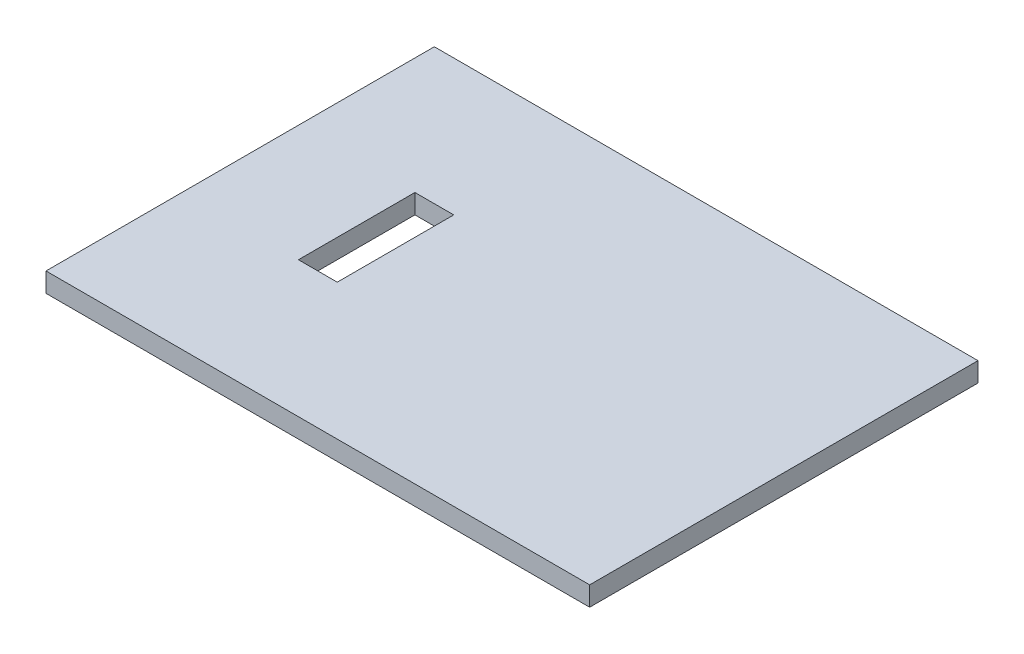
ISO-10303-21;
HEADER;
FILE_DESCRIPTION(('STEP AP214'),'2;1');
FILE_NAME('part.step','',(''),(''),'','','');
FILE_SCHEMA(('AUTOMOTIVE_DESIGN { 1 0 10303 214 1 1 1 1 }'));
ENDSEC;
DATA;
#1=APPLICATION_CONTEXT('core data for automotive mechanical design processes');
#2=APPLICATION_PROTOCOL_DEFINITION('international standard','automotive_design',2000,#1);
#3=PRODUCT_CONTEXT('',#1,'mechanical');
#4=PRODUCT('Part','Part','',(#3));
#5=PRODUCT_RELATED_PRODUCT_CATEGORY('part','',(#4));
#6=PRODUCT_DEFINITION_FORMATION('','',#4);
#7=PRODUCT_DEFINITION_CONTEXT('part definition',#1,'design');
#8=PRODUCT_DEFINITION('design','',#6,#7);
#9=PRODUCT_DEFINITION_SHAPE('','',#8);
#10=(LENGTH_UNIT() NAMED_UNIT(*) SI_UNIT(.MILLI.,.METRE.));
#11=(NAMED_UNIT(*) PLANE_ANGLE_UNIT() SI_UNIT($,.RADIAN.));
#12=(NAMED_UNIT(*) SI_UNIT($,.STERADIAN.) SOLID_ANGLE_UNIT());
#13=UNCERTAINTY_MEASURE_WITH_UNIT(LENGTH_MEASURE(1.E-05),#10,'distance_accuracy_value','');
#14=(GEOMETRIC_REPRESENTATION_CONTEXT(3) GLOBAL_UNCERTAINTY_ASSIGNED_CONTEXT((#13)) GLOBAL_UNIT_ASSIGNED_CONTEXT((#10,
#11,#12)) REPRESENTATION_CONTEXT('',''));
#15=CARTESIAN_POINT('',(0.,0.,0.));
#16=DIRECTION('',(0.,0.,1.));
#17=DIRECTION('',(1.,0.,0.));
#18=AXIS2_PLACEMENT_3D('',#15,#16,#17);
#19=CARTESIAN_POINT('',(-35.,2.5,25.));
#20=DIRECTION('',(1.,0.,0.));
#21=DIRECTION('',(0.,0.,-1.));
#22=AXIS2_PLACEMENT_3D('',#19,#20,#21);
#23=PLANE('',#22);
#24=DIRECTION('',(0.,0.,1.));
#25=VECTOR('',#24,1.);
#26=CARTESIAN_POINT('',(-35.,0.,25.));
#27=LINE('',#26,#25);
#28=CARTESIAN_POINT('',(-35.,0.,-25.));
#29=VERTEX_POINT('',#28);
#30=CARTESIAN_POINT('',(-35.,0.,25.));
#31=VERTEX_POINT('',#30);
#32=EDGE_CURVE('E130',#29,#31,#27,.T.);
#33=ORIENTED_EDGE('',*,*,#32,.T.);
#34=DIRECTION('',(0.,-1.,0.));
#35=VECTOR('',#34,1.);
#36=CARTESIAN_POINT('',(-35.,2.5,25.));
#37=LINE('',#36,#35);
#38=CARTESIAN_POINT('',(-35.,2.5,25.));
#39=VERTEX_POINT('',#38);
#40=EDGE_CURVE('E11',#39,#31,#37,.T.);
#41=ORIENTED_EDGE('',*,*,#40,.F.);
#42=DIRECTION('',(0.,0.,1.));
#43=VECTOR('',#42,1.);
#44=CARTESIAN_POINT('',(-35.,2.5,25.));
#45=LINE('',#44,#43);
#46=CARTESIAN_POINT('',(-35.,2.5,-25.));
#47=VERTEX_POINT('',#46);
#48=EDGE_CURVE('E134',#47,#39,#45,.T.);
#49=ORIENTED_EDGE('',*,*,#48,.F.);
#50=DIRECTION('',(0.,-1.,0.));
#51=VECTOR('',#50,1.);
#52=CARTESIAN_POINT('',(-35.,2.5,-25.));
#53=LINE('',#52,#51);
#54=EDGE_CURVE('E144',#47,#29,#53,.T.);
#55=ORIENTED_EDGE('',*,*,#54,.T.);
#56=EDGE_LOOP('',(#33,#41,#49,#55));
#57=FACE_BOUND('',#56,.T.);
#58=ADVANCED_FACE('F33',(#57),#23,.F.);
#59=CARTESIAN_POINT('',(35.,2.5,25.));
#60=DIRECTION('',(0.,0.,-1.));
#61=DIRECTION('',(-1.,0.,0.));
#62=AXIS2_PLACEMENT_3D('',#59,#60,#61);
#63=PLANE('',#62);
#64=DIRECTION('',(1.,0.,0.));
#65=VECTOR('',#64,1.);
#66=CARTESIAN_POINT('',(35.,0.,25.));
#67=LINE('',#66,#65);
#68=CARTESIAN_POINT('',(35.,0.,25.));
#69=VERTEX_POINT('',#68);
#70=EDGE_CURVE('E147',#31,#69,#67,.T.);
#71=ORIENTED_EDGE('',*,*,#70,.T.);
#72=DIRECTION('',(0.,-1.,0.));
#73=VECTOR('',#72,1.);
#74=CARTESIAN_POINT('',(35.,2.5,25.));
#75=LINE('',#74,#73);
#76=CARTESIAN_POINT('',(35.,2.5,25.));
#77=VERTEX_POINT('',#76);
#78=EDGE_CURVE('E40',#77,#69,#75,.T.);
#79=ORIENTED_EDGE('',*,*,#78,.F.);
#80=DIRECTION('',(1.,0.,0.));
#81=VECTOR('',#80,1.);
#82=CARTESIAN_POINT('',(35.,2.5,25.));
#83=LINE('',#82,#81);
#84=EDGE_CURVE('E137',#39,#77,#83,.T.);
#85=ORIENTED_EDGE('',*,*,#84,.F.);
#86=ORIENTED_EDGE('',*,*,#40,.T.);
#87=EDGE_LOOP('',(#71,#79,#85,#86));
#88=FACE_BOUND('',#87,.T.);
#89=ADVANCED_FACE('F175',(#88),#63,.F.);
#90=CARTESIAN_POINT('',(35.,2.5,25.));
#91=DIRECTION('',(-1.,0.,0.));
#92=DIRECTION('',(0.,0.,1.));
#93=AXIS2_PLACEMENT_3D('',#90,#91,#92);
#94=PLANE('',#93);
#95=DIRECTION('',(0.,0.,-1.));
#96=VECTOR('',#95,1.);
#97=CARTESIAN_POINT('',(35.,0.,25.));
#98=LINE('',#97,#96);
#99=CARTESIAN_POINT('',(35.,0.,-25.));
#100=VERTEX_POINT('',#99);
#101=EDGE_CURVE('E149',#69,#100,#98,.T.);
#102=ORIENTED_EDGE('',*,*,#101,.T.);
#103=DIRECTION('',(0.,-1.,0.));
#104=VECTOR('',#103,1.);
#105=CARTESIAN_POINT('',(35.,2.5,-25.));
#106=LINE('',#105,#104);
#107=CARTESIAN_POINT('',(35.,2.5,-25.));
#108=VERTEX_POINT('',#107);
#109=EDGE_CURVE('E154',#108,#100,#106,.T.);
#110=ORIENTED_EDGE('',*,*,#109,.F.);
#111=DIRECTION('',(0.,0.,-1.));
#112=VECTOR('',#111,1.);
#113=CARTESIAN_POINT('',(35.,2.5,25.));
#114=LINE('',#113,#112);
#115=EDGE_CURVE('E140',#77,#108,#114,.T.);
#116=ORIENTED_EDGE('',*,*,#115,.F.);
#117=ORIENTED_EDGE('',*,*,#78,.T.);
#118=EDGE_LOOP('',(#102,#110,#116,#117));
#119=FACE_BOUND('',#118,.T.);
#120=ADVANCED_FACE('F161',(#119),#94,.F.);
#121=CARTESIAN_POINT('',(35.,2.5,-25.));
#122=DIRECTION('',(0.,0.,1.));
#123=DIRECTION('',(1.,0.,0.));
#124=AXIS2_PLACEMENT_3D('',#121,#122,#123);
#125=PLANE('',#124);
#126=DIRECTION('',(-1.,0.,0.));
#127=VECTOR('',#126,1.);
#128=CARTESIAN_POINT('',(35.,0.,-25.));
#129=LINE('',#128,#127);
#130=EDGE_CURVE('E138',#100,#29,#129,.T.);
#131=ORIENTED_EDGE('',*,*,#130,.T.);
#132=ORIENTED_EDGE('',*,*,#54,.F.);
#133=DIRECTION('',(-1.,0.,0.));
#134=VECTOR('',#133,1.);
#135=CARTESIAN_POINT('',(35.,2.5,-25.));
#136=LINE('',#135,#134);
#137=EDGE_CURVE('E142',#108,#47,#136,.T.);
#138=ORIENTED_EDGE('',*,*,#137,.F.);
#139=ORIENTED_EDGE('',*,*,#109,.T.);
#140=EDGE_LOOP('',(#131,#132,#138,#139));
#141=FACE_BOUND('',#140,.T.);
#142=ADVANCED_FACE('F168',(#141),#125,.F.);
#143=CARTESIAN_POINT('',(0.,2.5,0.));
#144=DIRECTION('',(0.,1.,0.));
#145=DIRECTION('',(0.,0.,1.));
#146=AXIS2_PLACEMENT_3D('',#143,#144,#145);
#147=PLANE('',#146);
#148=DIRECTION('',(0.,0.,1.));
#149=VECTOR('',#148,1.);
#150=CARTESIAN_POINT('',(-20.,2.5,7.5));
#151=LINE('',#150,#149);
#152=CARTESIAN_POINT('',(-20.,2.5,-7.5));
#153=VERTEX_POINT('',#152);
#154=CARTESIAN_POINT('',(-20.,2.5,7.5));
#155=VERTEX_POINT('',#154);
#156=EDGE_CURVE('E47',#153,#155,#151,.T.);
#157=ORIENTED_EDGE('',*,*,#156,.F.);
#158=DIRECTION('',(-1.,0.,0.));
#159=VECTOR('',#158,1.);
#160=CARTESIAN_POINT('',(-15.,2.5,-7.5));
#161=LINE('',#160,#159);
#162=CARTESIAN_POINT('',(-15.,2.5,-7.5));
#163=VERTEX_POINT('',#162);
#164=EDGE_CURVE('E115',#163,#153,#161,.T.);
#165=ORIENTED_EDGE('',*,*,#164,.F.);
#166=DIRECTION('',(0.,0.,-1.));
#167=VECTOR('',#166,1.);
#168=CARTESIAN_POINT('',(-15.,2.5,7.5));
#169=LINE('',#168,#167);
#170=CARTESIAN_POINT('',(-15.,2.5,7.5));
#171=VERTEX_POINT('',#170);
#172=EDGE_CURVE('E118',#171,#163,#169,.T.);
#173=ORIENTED_EDGE('',*,*,#172,.F.);
#174=DIRECTION('',(1.,0.,0.));
#175=VECTOR('',#174,1.);
#176=CARTESIAN_POINT('',(-15.,2.5,7.5));
#177=LINE('',#176,#175);
#178=EDGE_CURVE('E124',#155,#171,#177,.T.);
#179=ORIENTED_EDGE('',*,*,#178,.F.);
#180=EDGE_LOOP('',(#157,#165,#173,#179));
#181=FACE_BOUND('',#180,.T.);
#182=ORIENTED_EDGE('',*,*,#48,.T.);
#183=ORIENTED_EDGE('',*,*,#84,.T.);
#184=ORIENTED_EDGE('',*,*,#115,.T.);
#185=ORIENTED_EDGE('',*,*,#137,.T.);
#186=EDGE_LOOP('',(#182,#183,#184,#185));
#187=FACE_BOUND('',#186,.T.);
#188=ADVANCED_FACE('F174',(#181,#187),#147,.T.);
#189=CARTESIAN_POINT('',(0.,0.,0.));
#190=DIRECTION('',(0.,1.,0.));
#191=DIRECTION('',(0.,0.,1.));
#192=AXIS2_PLACEMENT_3D('',#189,#190,#191);
#193=PLANE('',#192);
#194=DIRECTION('',(-1.,0.,0.));
#195=VECTOR('',#194,1.);
#196=CARTESIAN_POINT('',(-15.,0.,-7.5));
#197=LINE('',#196,#195);
#198=CARTESIAN_POINT('',(-15.,0.,-7.5));
#199=VERTEX_POINT('',#198);
#200=CARTESIAN_POINT('',(-20.,0.,-7.5));
#201=VERTEX_POINT('',#200);
#202=EDGE_CURVE('E105',#199,#201,#197,.T.);
#203=ORIENTED_EDGE('',*,*,#202,.T.);
#204=DIRECTION('',(0.,0.,1.));
#205=VECTOR('',#204,1.);
#206=CARTESIAN_POINT('',(-20.,0.,7.5));
#207=LINE('',#206,#205);
#208=CARTESIAN_POINT('',(-20.,0.,7.5));
#209=VERTEX_POINT('',#208);
#210=EDGE_CURVE('E99',#201,#209,#207,.T.);
#211=ORIENTED_EDGE('',*,*,#210,.T.);
#212=DIRECTION('',(1.,0.,0.));
#213=VECTOR('',#212,1.);
#214=CARTESIAN_POINT('',(-15.,0.,7.5));
#215=LINE('',#214,#213);
#216=CARTESIAN_POINT('',(-15.,0.,7.5));
#217=VERTEX_POINT('',#216);
#218=EDGE_CURVE('E108',#209,#217,#215,.T.);
#219=ORIENTED_EDGE('',*,*,#218,.T.);
#220=DIRECTION('',(0.,0.,-1.));
#221=VECTOR('',#220,1.);
#222=CARTESIAN_POINT('',(-15.,0.,7.5));
#223=LINE('',#222,#221);
#224=EDGE_CURVE('E55',#217,#199,#223,.T.);
#225=ORIENTED_EDGE('',*,*,#224,.T.);
#226=EDGE_LOOP('',(#203,#211,#219,#225));
#227=FACE_BOUND('',#226,.T.);
#228=ORIENTED_EDGE('',*,*,#32,.F.);
#229=ORIENTED_EDGE('',*,*,#130,.F.);
#230=ORIENTED_EDGE('',*,*,#101,.F.);
#231=ORIENTED_EDGE('',*,*,#70,.F.);
#232=EDGE_LOOP('',(#228,#229,#230,#231));
#233=FACE_BOUND('',#232,.T.);
#234=ADVANCED_FACE('F112',(#227,#233),#193,.F.);
#235=CARTESIAN_POINT('',(-20.,0.,7.5));
#236=DIRECTION('',(-1.,0.,0.));
#237=DIRECTION('',(0.,0.,1.));
#238=AXIS2_PLACEMENT_3D('',#235,#236,#237);
#239=PLANE('',#238);
#240=ORIENTED_EDGE('',*,*,#156,.T.);
#241=DIRECTION('',(0.,1.,0.));
#242=VECTOR('',#241,1.);
#243=CARTESIAN_POINT('',(-20.,0.,7.5));
#244=LINE('',#243,#242);
#245=EDGE_CURVE('E95',#209,#155,#244,.T.);
#246=ORIENTED_EDGE('',*,*,#245,.F.);
#247=ORIENTED_EDGE('',*,*,#210,.F.);
#248=DIRECTION('',(0.,1.,0.));
#249=VECTOR('',#248,1.);
#250=CARTESIAN_POINT('',(-20.,0.,-7.5));
#251=LINE('',#250,#249);
#252=EDGE_CURVE('E128',#201,#153,#251,.T.);
#253=ORIENTED_EDGE('',*,*,#252,.T.);
#254=EDGE_LOOP('',(#240,#246,#247,#253));
#255=FACE_BOUND('',#254,.T.);
#256=ADVANCED_FACE('F97',(#255),#239,.F.);
#257=CARTESIAN_POINT('',(-15.,0.,-7.5));
#258=DIRECTION('',(0.,0.,-1.));
#259=DIRECTION('',(-1.,0.,0.));
#260=AXIS2_PLACEMENT_3D('',#257,#258,#259);
#261=PLANE('',#260);
#262=ORIENTED_EDGE('',*,*,#164,.T.);
#263=ORIENTED_EDGE('',*,*,#252,.F.);
#264=ORIENTED_EDGE('',*,*,#202,.F.);
#265=DIRECTION('',(0.,1.,0.));
#266=VECTOR('',#265,1.);
#267=CARTESIAN_POINT('',(-15.,0.,-7.5));
#268=LINE('',#267,#266);
#269=EDGE_CURVE('E131',#199,#163,#268,.T.);
#270=ORIENTED_EDGE('',*,*,#269,.T.);
#271=EDGE_LOOP('',(#262,#263,#264,#270));
#272=FACE_BOUND('',#271,.T.);
#273=ADVANCED_FACE('F192',(#272),#261,.F.);
#274=CARTESIAN_POINT('',(-15.,0.,7.5));
#275=DIRECTION('',(1.,0.,0.));
#276=DIRECTION('',(0.,0.,-1.));
#277=AXIS2_PLACEMENT_3D('',#274,#275,#276);
#278=PLANE('',#277);
#279=ORIENTED_EDGE('',*,*,#172,.T.);
#280=ORIENTED_EDGE('',*,*,#269,.F.);
#281=ORIENTED_EDGE('',*,*,#224,.F.);
#282=DIRECTION('',(0.,1.,0.));
#283=VECTOR('',#282,1.);
#284=CARTESIAN_POINT('',(-15.,0.,7.5));
#285=LINE('',#284,#283);
#286=EDGE_CURVE('E104',#217,#171,#285,.T.);
#287=ORIENTED_EDGE('',*,*,#286,.T.);
#288=EDGE_LOOP('',(#279,#280,#281,#287));
#289=FACE_BOUND('',#288,.T.);
#290=ADVANCED_FACE('F195',(#289),#278,.F.);
#291=CARTESIAN_POINT('',(-15.,0.,7.5));
#292=DIRECTION('',(0.,0.,1.));
#293=DIRECTION('',(1.,0.,0.));
#294=AXIS2_PLACEMENT_3D('',#291,#292,#293);
#295=PLANE('',#294);
#296=ORIENTED_EDGE('',*,*,#178,.T.);
#297=ORIENTED_EDGE('',*,*,#286,.F.);
#298=ORIENTED_EDGE('',*,*,#218,.F.);
#299=ORIENTED_EDGE('',*,*,#245,.T.);
#300=EDGE_LOOP('',(#296,#297,#298,#299));
#301=FACE_BOUND('',#300,.T.);
#302=ADVANCED_FACE('F109',(#301),#295,.F.);
#303=CLOSED_SHELL('',(#58,#89,#120,#142,#188,#234,#256,#273,#290,#302));
#304=MANIFOLD_SOLID_BREP('B2',#303);
#305=ADVANCED_BREP_SHAPE_REPRESENTATION('',(#18,#304),#14);
#306=SHAPE_DEFINITION_REPRESENTATION(#9,#305);
ENDSEC;
END-ISO-10303-21;
